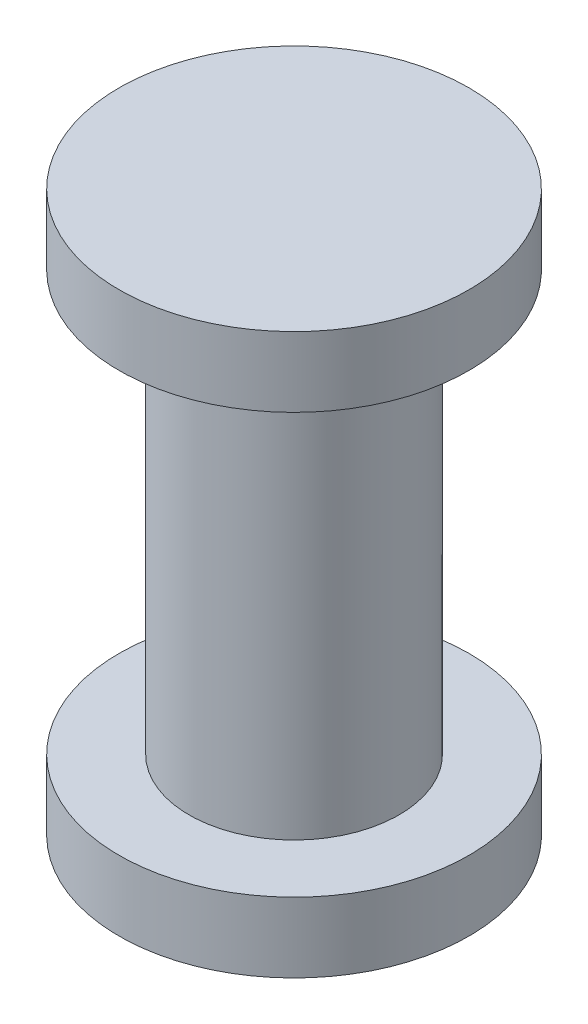
ISO-10303-21;
HEADER;
FILE_DESCRIPTION(('STEP AP214'),'2;1');
FILE_NAME('part.step','',(''),(''),'','','');
FILE_SCHEMA(('AUTOMOTIVE_DESIGN { 1 0 10303 214 1 1 1 1 }'));
ENDSEC;
DATA;
#1=APPLICATION_CONTEXT('core data for automotive mechanical design processes');
#2=APPLICATION_PROTOCOL_DEFINITION('international standard','automotive_design',2000,#1);
#3=PRODUCT_CONTEXT('',#1,'mechanical');
#4=PRODUCT('Part','Part','',(#3));
#5=PRODUCT_RELATED_PRODUCT_CATEGORY('part','',(#4));
#6=PRODUCT_DEFINITION_FORMATION('','',#4);
#7=PRODUCT_DEFINITION_CONTEXT('part definition',#1,'design');
#8=PRODUCT_DEFINITION('design','',#6,#7);
#9=PRODUCT_DEFINITION_SHAPE('','',#8);
#10=(LENGTH_UNIT() NAMED_UNIT(*) SI_UNIT(.MILLI.,.METRE.));
#11=(NAMED_UNIT(*) PLANE_ANGLE_UNIT() SI_UNIT($,.RADIAN.));
#12=(NAMED_UNIT(*) SI_UNIT($,.STERADIAN.) SOLID_ANGLE_UNIT());
#13=UNCERTAINTY_MEASURE_WITH_UNIT(LENGTH_MEASURE(1.E-05),#10,'distance_accuracy_value','');
#14=(GEOMETRIC_REPRESENTATION_CONTEXT(3) GLOBAL_UNCERTAINTY_ASSIGNED_CONTEXT((#13)) GLOBAL_UNIT_ASSIGNED_CONTEXT((#10,
#11,#12)) REPRESENTATION_CONTEXT('',''));
#15=CARTESIAN_POINT('',(0.,0.,0.));
#16=DIRECTION('',(0.,0.,1.));
#17=DIRECTION('',(1.,0.,0.));
#18=AXIS2_PLACEMENT_3D('',#15,#16,#17);
#19=CARTESIAN_POINT('',(-2.5,0.,0.));
#20=DIRECTION('',(0.,1.,0.));
#21=DIRECTION('',(0.,0.,1.));
#22=AXIS2_PLACEMENT_3D('',#19,#20,#21);
#23=PLANE('',#22);
#24=CARTESIAN_POINT('',(0.,0.,0.));
#25=DIRECTION('',(0.,-1.,0.));
#26=DIRECTION('',(0.,0.,-1.));
#27=AXIS2_PLACEMENT_3D('',#24,#25,#26);
#28=CIRCLE('',#27,2.5);
#29=CARTESIAN_POINT('',(0.,0.,-2.5));
#30=VERTEX_POINT('',#29);
#31=EDGE_CURVE('E56',#30,#30,#28,.T.);
#32=ORIENTED_EDGE('',*,*,#31,.T.);
#33=EDGE_LOOP('',(#32));
#34=FACE_BOUND('',#33,.T.);
#35=ADVANCED_FACE('F34',(#34),#23,.F.);
#36=CARTESIAN_POINT('',(0.,8.,0.));
#37=DIRECTION('',(0.,-1.,0.));
#38=DIRECTION('',(0.,0.,-1.));
#39=AXIS2_PLACEMENT_3D('',#36,#37,#38);
#40=PLANE('',#39);
#41=CARTESIAN_POINT('',(0.,8.,0.));
#42=DIRECTION('',(0.,-1.,0.));
#43=DIRECTION('',(0.,0.,-1.));
#44=AXIS2_PLACEMENT_3D('',#41,#42,#43);
#45=CIRCLE('',#44,2.5);
#46=CARTESIAN_POINT('',(0.,8.,-2.5));
#47=VERTEX_POINT('',#46);
#48=EDGE_CURVE('E10',#47,#47,#45,.T.);
#49=ORIENTED_EDGE('',*,*,#48,.F.);
#50=EDGE_LOOP('',(#49));
#51=FACE_BOUND('',#50,.T.);
#52=ADVANCED_FACE('F86',(#51),#40,.F.);
#53=CARTESIAN_POINT('',(0.,0.,0.));
#54=DIRECTION('',(0.,-1.,0.));
#55=DIRECTION('',(0.,0.,-1.));
#56=AXIS2_PLACEMENT_3D('',#53,#54,#55);
#57=CYLINDRICAL_SURFACE('',#56,2.5);
#58=CARTESIAN_POINT('',(0.,7.,0.));
#59=DIRECTION('',(0.,-1.,0.));
#60=DIRECTION('',(0.,0.,-1.));
#61=AXIS2_PLACEMENT_3D('',#58,#59,#60);
#62=CIRCLE('',#61,2.5);
#63=CARTESIAN_POINT('',(0.,7.,-2.5));
#64=VERTEX_POINT('',#63);
#65=EDGE_CURVE('E40',#64,#64,#62,.T.);
#66=ORIENTED_EDGE('',*,*,#65,.F.);
#67=EDGE_LOOP('',(#66));
#68=FACE_BOUND('',#67,.T.);
#69=ORIENTED_EDGE('',*,*,#48,.T.);
#70=EDGE_LOOP('',(#69));
#71=FACE_BOUND('',#70,.T.);
#72=ADVANCED_FACE('F81',(#68,#71),#57,.T.);
#73=CARTESIAN_POINT('',(-2.5,7.,0.));
#74=DIRECTION('',(0.,1.,0.));
#75=DIRECTION('',(0.,0.,1.));
#76=AXIS2_PLACEMENT_3D('',#73,#74,#75);
#77=PLANE('',#76);
#78=CARTESIAN_POINT('',(0.,7.,0.));
#79=DIRECTION('',(0.,-1.,0.));
#80=DIRECTION('',(0.,0.,-1.));
#81=AXIS2_PLACEMENT_3D('',#78,#79,#80);
#82=CIRCLE('',#81,1.5);
#83=CARTESIAN_POINT('',(0.,7.,-1.5));
#84=VERTEX_POINT('',#83);
#85=EDGE_CURVE('E44',#84,#84,#82,.T.);
#86=ORIENTED_EDGE('',*,*,#85,.F.);
#87=EDGE_LOOP('',(#86));
#88=FACE_BOUND('',#87,.T.);
#89=ORIENTED_EDGE('',*,*,#65,.T.);
#90=EDGE_LOOP('',(#89));
#91=FACE_BOUND('',#90,.T.);
#92=ADVANCED_FACE('F76',(#88,#91),#77,.F.);
#93=CARTESIAN_POINT('',(0.,0.,0.));
#94=DIRECTION('',(0.,-1.,0.));
#95=DIRECTION('',(0.,0.,-1.));
#96=AXIS2_PLACEMENT_3D('',#93,#94,#95);
#97=CYLINDRICAL_SURFACE('',#96,1.5);
#98=CARTESIAN_POINT('',(0.,1.,0.));
#99=DIRECTION('',(0.,-1.,0.));
#100=DIRECTION('',(0.,0.,-1.));
#101=AXIS2_PLACEMENT_3D('',#98,#99,#100);
#102=CIRCLE('',#101,1.5);
#103=CARTESIAN_POINT('',(0.,1.,-1.5));
#104=VERTEX_POINT('',#103);
#105=EDGE_CURVE('E48',#104,#104,#102,.T.);
#106=ORIENTED_EDGE('',*,*,#105,.F.);
#107=EDGE_LOOP('',(#106));
#108=FACE_BOUND('',#107,.T.);
#109=ORIENTED_EDGE('',*,*,#85,.T.);
#110=EDGE_LOOP('',(#109));
#111=FACE_BOUND('',#110,.T.);
#112=ADVANCED_FACE('F70',(#108,#111),#97,.T.);
#113=CARTESIAN_POINT('',(-1.5,1.,0.));
#114=DIRECTION('',(0.,-1.,0.));
#115=DIRECTION('',(0.,0.,-1.));
#116=AXIS2_PLACEMENT_3D('',#113,#114,#115);
#117=PLANE('',#116);
#118=CARTESIAN_POINT('',(0.,1.,0.));
#119=DIRECTION('',(0.,-1.,0.));
#120=DIRECTION('',(0.,0.,-1.));
#121=AXIS2_PLACEMENT_3D('',#118,#119,#120);
#122=CIRCLE('',#121,2.5);
#123=CARTESIAN_POINT('',(0.,1.,-2.5));
#124=VERTEX_POINT('',#123);
#125=EDGE_CURVE('E53',#124,#124,#122,.T.);
#126=ORIENTED_EDGE('',*,*,#125,.F.);
#127=EDGE_LOOP('',(#126));
#128=FACE_BOUND('',#127,.T.);
#129=ORIENTED_EDGE('',*,*,#105,.T.);
#130=EDGE_LOOP('',(#129));
#131=FACE_BOUND('',#130,.T.);
#132=ADVANCED_FACE('F64',(#128,#131),#117,.F.);
#133=CARTESIAN_POINT('',(0.,0.,0.));
#134=DIRECTION('',(0.,-1.,0.));
#135=DIRECTION('',(0.,0.,-1.));
#136=AXIS2_PLACEMENT_3D('',#133,#134,#135);
#137=CYLINDRICAL_SURFACE('',#136,2.5);
#138=ORIENTED_EDGE('',*,*,#31,.F.);
#139=EDGE_LOOP('',(#138));
#140=FACE_BOUND('',#139,.T.);
#141=ORIENTED_EDGE('',*,*,#125,.T.);
#142=EDGE_LOOP('',(#141));
#143=FACE_BOUND('',#142,.T.);
#144=ADVANCED_FACE('F61',(#140,#143),#137,.T.);
#145=CLOSED_SHELL('',(#35,#52,#72,#92,#112,#132,#144));
#146=MANIFOLD_SOLID_BREP('B2',#145);
#147=ADVANCED_BREP_SHAPE_REPRESENTATION('',(#18,#146),#14);
#148=SHAPE_DEFINITION_REPRESENTATION(#9,#147);
ENDSEC;
END-ISO-10303-21;
